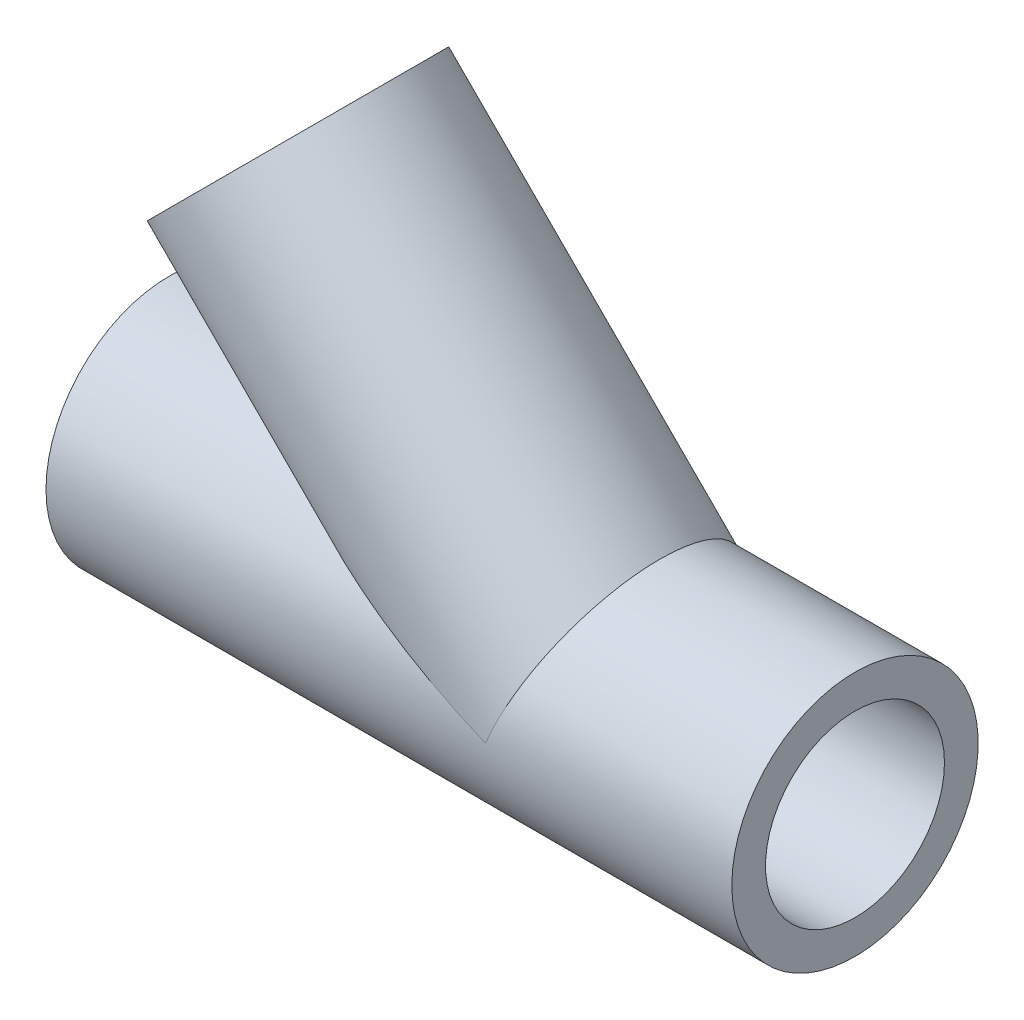
ISO-10303-21;
HEADER;
FILE_DESCRIPTION(('STEP AP214'),'2;1');
FILE_NAME('part.step','',(''),(''),'','','');
FILE_SCHEMA(('AUTOMOTIVE_DESIGN { 1 0 10303 214 1 1 1 1 }'));
ENDSEC;
DATA;
#1=APPLICATION_CONTEXT('core data for automotive mechanical design processes');
#2=APPLICATION_PROTOCOL_DEFINITION('international standard','automotive_design',2000,#1);
#3=PRODUCT_CONTEXT('',#1,'mechanical');
#4=PRODUCT('Part','Part','',(#3));
#5=PRODUCT_RELATED_PRODUCT_CATEGORY('part','',(#4));
#6=PRODUCT_DEFINITION_FORMATION('','',#4);
#7=PRODUCT_DEFINITION_CONTEXT('part definition',#1,'design');
#8=PRODUCT_DEFINITION('design','',#6,#7);
#9=PRODUCT_DEFINITION_SHAPE('','',#8);
#10=(LENGTH_UNIT() NAMED_UNIT(*) SI_UNIT(.MILLI.,.METRE.));
#11=(NAMED_UNIT(*) PLANE_ANGLE_UNIT() SI_UNIT($,.RADIAN.));
#12=(NAMED_UNIT(*) SI_UNIT($,.STERADIAN.) SOLID_ANGLE_UNIT());
#13=UNCERTAINTY_MEASURE_WITH_UNIT(LENGTH_MEASURE(1.E-05),#10,'distance_accuracy_value','');
#14=(GEOMETRIC_REPRESENTATION_CONTEXT(3) GLOBAL_UNCERTAINTY_ASSIGNED_CONTEXT((#13)) GLOBAL_UNIT_ASSIGNED_CONTEXT((#10,
#11,#12)) REPRESENTATION_CONTEXT('',''));
#15=CARTESIAN_POINT('',(0.,0.,0.));
#16=DIRECTION('',(0.,0.,1.));
#17=DIRECTION('',(1.,0.,0.));
#18=AXIS2_PLACEMENT_3D('',#15,#16,#17);
#19=CARTESIAN_POINT('',(0.,0.,0.));
#20=DIRECTION('',(-1.,0.,0.));
#21=DIRECTION('',(0.,0.,1.));
#22=AXIS2_PLACEMENT_3D('',#19,#20,#21);
#23=CYLINDRICAL_SURFACE('',#22,14.684375);
#24=CARTESIAN_POINT('',(40.878125,0.,0.));
#25=DIRECTION('',(-1.,0.,0.));
#26=DIRECTION('',(0.,0.,1.));
#27=AXIS2_PLACEMENT_3D('',#24,#25,#26);
#28=CIRCLE('',#27,14.684375);
#29=CARTESIAN_POINT('',(40.878125,0.,14.684375));
#30=VERTEX_POINT('',#29);
#31=EDGE_CURVE('E83',#30,#30,#28,.T.);
#32=ORIENTED_EDGE('',*,*,#31,.T.);
#33=EDGE_LOOP('',(#32));
#34=FACE_BOUND('',#33,.T.);
#35=CARTESIAN_POINT('',(-40.878125,0.,0.));
#36=DIRECTION('',(-1.,0.,0.));
#37=DIRECTION('',(0.,0.,1.));
#38=AXIS2_PLACEMENT_3D('',#35,#36,#37);
#39=CIRCLE('',#38,14.684375);
#40=CARTESIAN_POINT('',(-40.878125,0.,14.684375));
#41=VERTEX_POINT('',#40);
#42=EDGE_CURVE('E80',#41,#41,#39,.T.);
#43=ORIENTED_EDGE('',*,*,#42,.F.);
#44=EDGE_LOOP('',(#43));
#45=FACE_BOUND('',#44,.T.);
#46=CARTESIAN_POINT('',(11.509375,0.,0.));
#47=DIRECTION('',(-0.382683432365091,-0.923879532511287,0.));
#48=DIRECTION('',(-0.923879532511287,0.382683432365091,0.));
#49=AXIS2_PLACEMENT_3D('',#46,#47,#48);
#50=ELLIPSE('',#49,38.372121074713,14.684375);
#51=CARTESIAN_POINT('',(11.509375,0.,-14.684375));
#52=VERTEX_POINT('',#51);
#53=CARTESIAN_POINT('',(11.509375,0.,14.684375));
#54=VERTEX_POINT('',#53);
#55=EDGE_CURVE('E11',#52,#54,#50,.F.);
#56=ORIENTED_EDGE('',*,*,#55,.F.);
#57=CARTESIAN_POINT('',(11.509375,0.,0.));
#58=DIRECTION('',(-0.923879532511287,0.382683432365091,0.));
#59=DIRECTION('',(-0.382683432365091,-0.923879532511287,0.));
#60=AXIS2_PLACEMENT_3D('',#57,#58,#59);
#61=ELLIPSE('',#60,15.8942529661686,14.684375);
#62=EDGE_CURVE('E42',#54,#52,#61,.T.);
#63=ORIENTED_EDGE('',*,*,#62,.F.);
#64=EDGE_LOOP('',(#56,#63));
#65=FACE_BOUND('',#64,.T.);
#66=ADVANCED_FACE('F34',(#34,#45,#65),#23,.T.);
#67=CARTESIAN_POINT('',(-40.878125,0.,0.));
#68=DIRECTION('',(1.,0.,0.));
#69=DIRECTION('',(0.,0.,-1.));
#70=AXIS2_PLACEMENT_3D('',#67,#68,#69);
#71=PLANE('',#70);
#72=CARTESIAN_POINT('',(-40.878125,0.,0.));
#73=DIRECTION('',(1.,0.,0.));
#74=DIRECTION('',(0.,0.,-1.));
#75=AXIS2_PLACEMENT_3D('',#72,#73,#74);
#76=CIRCLE('',#75,10.668);
#77=CARTESIAN_POINT('',(-40.878125,0.,-10.668));
#78=VERTEX_POINT('',#77);
#79=EDGE_CURVE('E123',#78,#78,#76,.T.);
#80=ORIENTED_EDGE('',*,*,#79,.T.);
#81=EDGE_LOOP('',(#80));
#82=FACE_BOUND('',#81,.T.);
#83=ORIENTED_EDGE('',*,*,#42,.T.);
#84=EDGE_LOOP('',(#83));
#85=FACE_BOUND('',#84,.T.);
#86=ADVANCED_FACE('F36',(#82,#85),#71,.F.);
#87=CARTESIAN_POINT('',(40.878125,14.684375,0.));
#88=DIRECTION('',(-1.,0.,0.));
#89=DIRECTION('',(0.,0.,1.));
#90=AXIS2_PLACEMENT_3D('',#87,#88,#89);
#91=PLANE('',#90);
#92=CARTESIAN_POINT('',(40.878125,0.,0.));
#93=DIRECTION('',(1.,0.,0.));
#94=DIRECTION('',(0.,0.,-1.));
#95=AXIS2_PLACEMENT_3D('',#92,#93,#94);
#96=CIRCLE('',#95,10.668);
#97=CARTESIAN_POINT('',(40.878125,0.,-10.668));
#98=VERTEX_POINT('',#97);
#99=EDGE_CURVE('E61',#98,#98,#96,.T.);
#100=ORIENTED_EDGE('',*,*,#99,.F.);
#101=EDGE_LOOP('',(#100));
#102=FACE_BOUND('',#101,.T.);
#103=ORIENTED_EDGE('',*,*,#31,.F.);
#104=EDGE_LOOP('',(#103));
#105=FACE_BOUND('',#104,.T.);
#106=ADVANCED_FACE('F93',(#102,#105),#91,.F.);
#107=CARTESIAN_POINT('',(-22.9184744398564,34.4278494398565,0.));
#108=DIRECTION('',(0.707106781186546,-0.707106781186549,0.));
#109=DIRECTION('',(0.707106781186549,0.707106781186546,0.));
#110=AXIS2_PLACEMENT_3D('',#107,#108,#109);
#111=CYLINDRICAL_SURFACE('',#110,14.684375);
#112=CARTESIAN_POINT('',(-25.5341814994102,37.0435564994103,0.));
#113=DIRECTION('',(0.707106781186546,-0.707106781186549,0.));
#114=DIRECTION('',(0.707106781186549,0.707106781186546,0.));
#115=AXIS2_PLACEMENT_3D('',#112,#113,#114);
#116=CIRCLE('',#115,14.684375);
#117=CARTESIAN_POINT('',(-15.1507603594239,47.4269776393965,0.));
#118=VERTEX_POINT('',#117);
#119=EDGE_CURVE('E77',#118,#118,#116,.T.);
#120=ORIENTED_EDGE('',*,*,#119,.T.);
#121=EDGE_LOOP('',(#120));
#122=FACE_BOUND('',#121,.T.);
#123=ORIENTED_EDGE('',*,*,#62,.T.);
#124=ORIENTED_EDGE('',*,*,#55,.T.);
#125=EDGE_LOOP('',(#123,#124));
#126=FACE_BOUND('',#125,.T.);
#127=ADVANCED_FACE('F86',(#122,#126),#111,.T.);
#128=CARTESIAN_POINT('',(-35.9176026393964,26.6601353594241,0.));
#129=DIRECTION('',(0.707106781186546,-0.707106781186549,0.));
#130=DIRECTION('',(0.707106781186549,0.707106781186546,0.));
#131=AXIS2_PLACEMENT_3D('',#128,#129,#130);
#132=PLANE('',#131);
#133=CARTESIAN_POINT('',(-25.5341814996513,37.0435564991692,0.));
#134=DIRECTION('',(-0.707106781186548,0.707106781186547,0.));
#135=DIRECTION('',(-0.707106781186547,-0.707106781186548,0.));
#136=AXIS2_PLACEMENT_3D('',#133,#134,#135);
#137=CIRCLE('',#136,10.668);
#138=CARTESIAN_POINT('',(-33.0775966413494,29.5001413574711,0.));
#139=VERTEX_POINT('',#138);
#140=EDGE_CURVE('E74',#139,#139,#137,.T.);
#141=ORIENTED_EDGE('',*,*,#140,.F.);
#142=EDGE_LOOP('',(#141));
#143=FACE_BOUND('',#142,.T.);
#144=ORIENTED_EDGE('',*,*,#119,.F.);
#145=EDGE_LOOP('',(#144));
#146=FACE_BOUND('',#145,.T.);
#147=ADVANCED_FACE('F97',(#143,#146),#132,.F.);
#148=CARTESIAN_POINT('',(-25.5341814996513,37.0435564991692,0.));
#149=DIRECTION('',(-0.707106781186548,0.707106781186547,0.));
#150=DIRECTION('',(-0.707106781186547,-0.707106781186548,0.));
#151=AXIS2_PLACEMENT_3D('',#148,#149,#150);
#152=CYLINDRICAL_SURFACE('',#151,10.668);
#153=CARTESIAN_POINT('',(-9.8187332877803,21.3281082872982,0.));
#154=DIRECTION('',(-0.707106781186548,0.707106781186547,0.));
#155=DIRECTION('',(-0.707106781186547,-0.707106781186548,0.));
#156=AXIS2_PLACEMENT_3D('',#153,#154,#155);
#157=CIRCLE('',#156,10.668);
#158=CARTESIAN_POINT('',(-17.3621484294784,13.7846931456001,0.));
#159=VERTEX_POINT('',#158);
#160=EDGE_CURVE('E68',#159,#159,#157,.T.);
#161=ORIENTED_EDGE('',*,*,#160,.F.);
#162=EDGE_LOOP('',(#161));
#163=FACE_BOUND('',#162,.T.);
#164=ORIENTED_EDGE('',*,*,#140,.T.);
#165=EDGE_LOOP('',(#164));
#166=FACE_BOUND('',#165,.T.);
#167=ADVANCED_FACE('F162',(#163,#166),#152,.F.);
#168=CARTESIAN_POINT('',(-17.3621484294784,13.7846931456001,0.));
#169=DIRECTION('',(0.707106781186548,-0.707106781186547,0.));
#170=DIRECTION('',(0.707106781186547,0.707106781186548,0.));
#171=AXIS2_PLACEMENT_3D('',#168,#169,#170);
#172=PLANE('',#171);
#173=CARTESIAN_POINT('',(-9.8187332877803,21.3281082872982,0.));
#174=DIRECTION('',(-0.707106781186548,0.707106781186547,0.));
#175=DIRECTION('',(-0.707106781186547,-0.707106781186548,0.));
#176=AXIS2_PLACEMENT_3D('',#173,#174,#175);
#177=CIRCLE('',#176,7.89940000000002);
#178=CARTESIAN_POINT('',(-15.4044525950853,15.7423889799931,0.));
#179=VERTEX_POINT('',#178);
#180=EDGE_CURVE('E65',#179,#179,#177,.T.);
#181=ORIENTED_EDGE('',*,*,#180,.F.);
#182=EDGE_LOOP('',(#181));
#183=FACE_BOUND('',#182,.T.);
#184=ORIENTED_EDGE('',*,*,#160,.T.);
#185=EDGE_LOOP('',(#184));
#186=FACE_BOUND('',#185,.T.);
#187=ADVANCED_FACE('F159',(#183,#186),#172,.F.);
#188=CARTESIAN_POINT('',(-25.5341814996513,37.0435564991692,0.));
#189=DIRECTION('',(-0.707106781186548,0.707106781186547,0.));
#190=DIRECTION('',(-0.707106781186547,-0.707106781186548,0.));
#191=AXIS2_PLACEMENT_3D('',#188,#189,#190);
#192=CYLINDRICAL_SURFACE('',#191,7.89940000000001);
#193=CARTESIAN_POINT('',(11.5093749995179,0.,0.));
#194=DIRECTION('',(-0.923879532511287,0.38268343236509,0.));
#195=DIRECTION('',(0.382683432365089,0.923879532511287,0.));
#196=AXIS2_PLACEMENT_3D('',#193,#194,#195);
#197=ELLIPSE('',#196,8.55024894698974,7.8994);
#198=CARTESIAN_POINT('',(11.5093749995179,-4.82125187407973E-10,-7.89939999999999));
#199=VERTEX_POINT('',#198);
#200=CARTESIAN_POINT('',(11.5093749995179,-4.82125624146069E-10,7.8994));
#201=VERTEX_POINT('',#200);
#202=EDGE_CURVE('E58',#199,#201,#197,.F.);
#203=ORIENTED_EDGE('',*,*,#202,.T.);
#204=CARTESIAN_POINT('',(11.5093749995179,0.,0.));
#205=DIRECTION('',(0.382683432365089,0.923879532511287,0.));
#206=DIRECTION('',(-0.923879532511287,0.38268343236509,0.));
#207=AXIS2_PLACEMENT_3D('',#204,#205,#206);
#208=ELLIPSE('',#207,20.6421269694889,7.8994);
#209=EDGE_CURVE('E48',#201,#199,#208,.F.);
#210=ORIENTED_EDGE('',*,*,#209,.T.);
#211=EDGE_LOOP('',(#203,#210));
#212=FACE_BOUND('',#211,.T.);
#213=ORIENTED_EDGE('',*,*,#180,.T.);
#214=EDGE_LOOP('',(#213));
#215=FACE_BOUND('',#214,.T.);
#216=ADVANCED_FACE('F63',(#212,#215),#192,.F.);
#217=CARTESIAN_POINT('',(17.8593750000005,0.,0.));
#218=DIRECTION('',(1.,0.,0.));
#219=DIRECTION('',(0.,0.,-1.));
#220=AXIS2_PLACEMENT_3D('',#217,#218,#219);
#221=CYLINDRICAL_SURFACE('',#220,7.89939999999999);
#222=CARTESIAN_POINT('',(-18.653125,0.,0.));
#223=DIRECTION('',(1.,0.,0.));
#224=DIRECTION('',(0.,0.,-1.));
#225=AXIS2_PLACEMENT_3D('',#222,#223,#224);
#226=CIRCLE('',#225,7.89939999999999);
#227=CARTESIAN_POINT('',(-18.653125,0.,-7.89939999999999));
#228=VERTEX_POINT('',#227);
#229=EDGE_CURVE('E117',#228,#228,#226,.T.);
#230=ORIENTED_EDGE('',*,*,#229,.F.);
#231=EDGE_LOOP('',(#230));
#232=FACE_BOUND('',#231,.T.);
#233=CARTESIAN_POINT('',(17.859375,0.,0.));
#234=DIRECTION('',(1.,0.,0.));
#235=DIRECTION('',(0.,0.,-1.));
#236=AXIS2_PLACEMENT_3D('',#233,#234,#235);
#237=CIRCLE('',#236,7.8994);
#238=CARTESIAN_POINT('',(17.859375,0.,-7.8994));
#239=VERTEX_POINT('',#238);
#240=EDGE_CURVE('E112',#239,#239,#237,.T.);
#241=ORIENTED_EDGE('',*,*,#240,.T.);
#242=EDGE_LOOP('',(#241));
#243=FACE_BOUND('',#242,.T.);
#244=ORIENTED_EDGE('',*,*,#202,.F.);
#245=ORIENTED_EDGE('',*,*,#209,.F.);
#246=EDGE_LOOP('',(#244,#245));
#247=FACE_BOUND('',#246,.T.);
#248=ADVANCED_FACE('F59',(#232,#243,#247),#221,.F.);
#249=CARTESIAN_POINT('',(17.8593750000005,0.,0.));
#250=DIRECTION('',(1.,0.,0.));
#251=DIRECTION('',(0.,0.,-1.));
#252=AXIS2_PLACEMENT_3D('',#249,#250,#251);
#253=CYLINDRICAL_SURFACE('',#252,10.668);
#254=CARTESIAN_POINT('',(17.859375,0.,0.));
#255=DIRECTION('',(1.,0.,0.));
#256=DIRECTION('',(0.,0.,-1.));
#257=AXIS2_PLACEMENT_3D('',#254,#255,#256);
#258=CIRCLE('',#257,10.668);
#259=CARTESIAN_POINT('',(17.859375,0.,-10.668));
#260=VERTEX_POINT('',#259);
#261=EDGE_CURVE('E110',#260,#260,#258,.T.);
#262=ORIENTED_EDGE('',*,*,#261,.F.);
#263=EDGE_LOOP('',(#262));
#264=FACE_BOUND('',#263,.T.);
#265=ORIENTED_EDGE('',*,*,#99,.T.);
#266=EDGE_LOOP('',(#265));
#267=FACE_BOUND('',#266,.T.);
#268=ADVANCED_FACE('F143',(#264,#267),#253,.F.);
#269=CARTESIAN_POINT('',(17.859375,10.668,0.));
#270=DIRECTION('',(-1.,0.,0.));
#271=DIRECTION('',(0.,0.,1.));
#272=AXIS2_PLACEMENT_3D('',#269,#270,#271);
#273=PLANE('',#272);
#274=ORIENTED_EDGE('',*,*,#240,.F.);
#275=EDGE_LOOP('',(#274));
#276=FACE_BOUND('',#275,.T.);
#277=ORIENTED_EDGE('',*,*,#261,.T.);
#278=EDGE_LOOP('',(#277));
#279=FACE_BOUND('',#278,.T.);
#280=ADVANCED_FACE('F137',(#276,#279),#273,.F.);
#281=CARTESIAN_POINT('',(-18.653125,7.89939999999999,0.));
#282=DIRECTION('',(1.,0.,0.));
#283=DIRECTION('',(0.,0.,-1.));
#284=AXIS2_PLACEMENT_3D('',#281,#282,#283);
#285=PLANE('',#284);
#286=CARTESIAN_POINT('',(-18.653125,0.,0.));
#287=DIRECTION('',(1.,0.,0.));
#288=DIRECTION('',(0.,0.,-1.));
#289=AXIS2_PLACEMENT_3D('',#286,#287,#288);
#290=CIRCLE('',#289,10.668);
#291=CARTESIAN_POINT('',(-18.653125,0.,-10.668));
#292=VERTEX_POINT('',#291);
#293=EDGE_CURVE('E120',#292,#292,#290,.T.);
#294=ORIENTED_EDGE('',*,*,#293,.F.);
#295=EDGE_LOOP('',(#294));
#296=FACE_BOUND('',#295,.T.);
#297=ORIENTED_EDGE('',*,*,#229,.T.);
#298=EDGE_LOOP('',(#297));
#299=FACE_BOUND('',#298,.T.);
#300=ADVANCED_FACE('F131',(#296,#299),#285,.F.);
#301=CARTESIAN_POINT('',(17.8593750000005,0.,0.));
#302=DIRECTION('',(1.,0.,0.));
#303=DIRECTION('',(0.,0.,-1.));
#304=AXIS2_PLACEMENT_3D('',#301,#302,#303);
#305=CYLINDRICAL_SURFACE('',#304,10.668);
#306=ORIENTED_EDGE('',*,*,#79,.F.);
#307=EDGE_LOOP('',(#306));
#308=FACE_BOUND('',#307,.T.);
#309=ORIENTED_EDGE('',*,*,#293,.T.);
#310=EDGE_LOOP('',(#309));
#311=FACE_BOUND('',#310,.T.);
#312=ADVANCED_FACE('F128',(#308,#311),#305,.F.);
#313=CLOSED_SHELL('',(#66,#86,#106,#127,#147,#167,#187,#216,#248,#268,#280,#300,#312));
#314=MANIFOLD_SOLID_BREP('B2',#313);
#315=ADVANCED_BREP_SHAPE_REPRESENTATION('',(#18,#314),#14);
#316=SHAPE_DEFINITION_REPRESENTATION(#9,#315);
ENDSEC;
END-ISO-10303-21;
